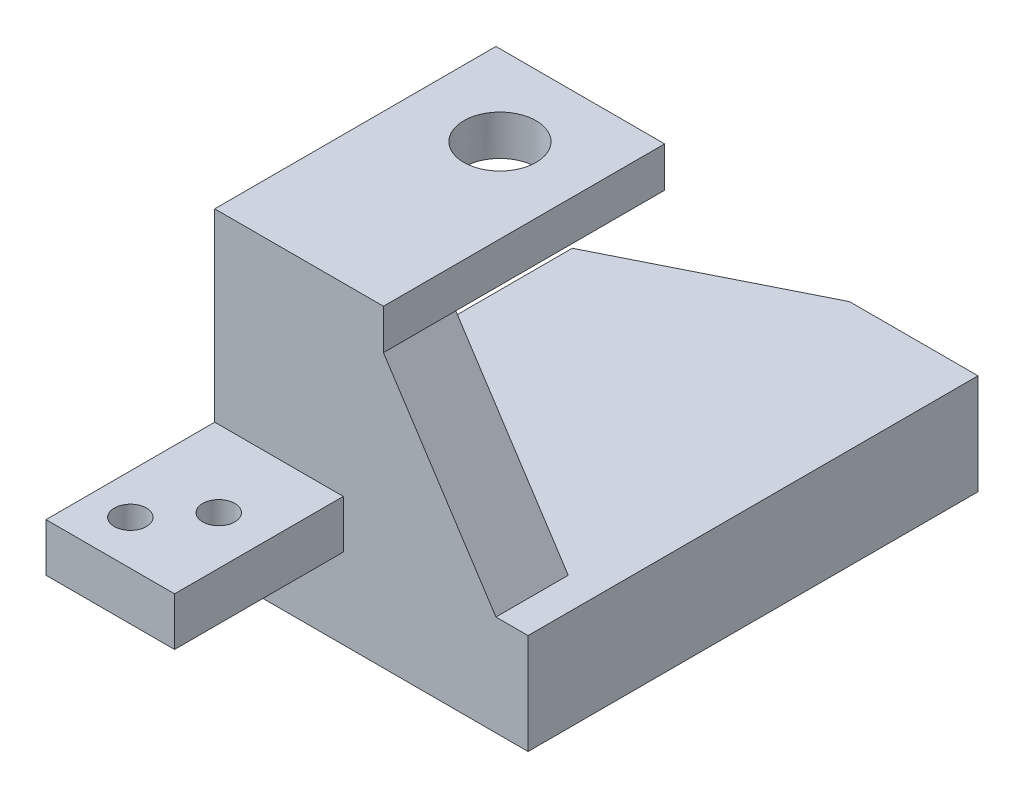
ISO-10303-21;
HEADER;
FILE_DESCRIPTION(('STEP AP214'),'2;1');
FILE_NAME('part.step','',(''),(''),'','','');
FILE_SCHEMA(('AUTOMOTIVE_DESIGN { 1 0 10303 214 1 1 1 1 }'));
ENDSEC;
DATA;
#1=APPLICATION_CONTEXT('core data for automotive mechanical design processes');
#2=APPLICATION_PROTOCOL_DEFINITION('international standard','automotive_design',2000,#1);
#3=PRODUCT_CONTEXT('',#1,'mechanical');
#4=PRODUCT('Part','Part','',(#3));
#5=PRODUCT_RELATED_PRODUCT_CATEGORY('part','',(#4));
#6=PRODUCT_DEFINITION_FORMATION('','',#4);
#7=PRODUCT_DEFINITION_CONTEXT('part definition',#1,'design');
#8=PRODUCT_DEFINITION('design','',#6,#7);
#9=PRODUCT_DEFINITION_SHAPE('','',#8);
#10=(LENGTH_UNIT() NAMED_UNIT(*) SI_UNIT(.MILLI.,.METRE.));
#11=(NAMED_UNIT(*) PLANE_ANGLE_UNIT() SI_UNIT($,.RADIAN.));
#12=(NAMED_UNIT(*) SI_UNIT($,.STERADIAN.) SOLID_ANGLE_UNIT());
#13=UNCERTAINTY_MEASURE_WITH_UNIT(LENGTH_MEASURE(1.E-05),#10,'distance_accuracy_value','');
#14=(GEOMETRIC_REPRESENTATION_CONTEXT(3) GLOBAL_UNCERTAINTY_ASSIGNED_CONTEXT((#13)) GLOBAL_UNIT_ASSIGNED_CONTEXT((#10,
#11,#12)) REPRESENTATION_CONTEXT('',''));
#15=CARTESIAN_POINT('',(0.,0.,0.));
#16=DIRECTION('',(0.,0.,1.));
#17=DIRECTION('',(1.,0.,0.));
#18=AXIS2_PLACEMENT_3D('',#15,#16,#17);
#19=CARTESIAN_POINT('',(57.3075506445673,-25.,0.));
#20=DIRECTION('',(-1.,0.,0.));
#21=DIRECTION('',(0.,0.,1.));
#22=AXIS2_PLACEMENT_3D('',#19,#20,#21);
#23=PLANE('',#22);
#24=DIRECTION('',(0.,1.,0.));
#25=VECTOR('',#24,1.);
#26=CARTESIAN_POINT('',(57.3075506445673,-25.,0.));
#27=LINE('',#26,#25);
#28=CARTESIAN_POINT('',(57.3075506445673,-25.,0.));
#29=VERTEX_POINT('',#28);
#30=CARTESIAN_POINT('',(57.3075506445673,-5.,0.));
#31=VERTEX_POINT('',#30);
#32=EDGE_CURVE('E266',#29,#31,#27,.T.);
#33=ORIENTED_EDGE('',*,*,#32,.T.);
#34=DIRECTION('',(0.,0.,1.));
#35=VECTOR('',#34,1.);
#36=CARTESIAN_POINT('',(57.3075506445673,-5.,0.));
#37=LINE('',#36,#35);
#38=CARTESIAN_POINT('',(57.3075506445673,-5.,42.));
#39=VERTEX_POINT('',#38);
#40=EDGE_CURVE('E53',#31,#39,#37,.T.);
#41=ORIENTED_EDGE('',*,*,#40,.T.);
#42=DIRECTION('',(0.,1.,0.));
#43=VECTOR('',#42,1.);
#44=CARTESIAN_POINT('',(57.3075506445673,-5.,42.));
#45=LINE('',#44,#43);
#46=CARTESIAN_POINT('',(57.3075506445673,7.,42.));
#47=VERTEX_POINT('',#46);
#48=EDGE_CURVE('E166',#39,#47,#45,.T.);
#49=ORIENTED_EDGE('',*,*,#48,.T.);
#50=DIRECTION('',(0.,0.,-1.));
#51=VECTOR('',#50,1.);
#52=CARTESIAN_POINT('',(57.3075506445673,7.,0.));
#53=LINE('',#52,#51);
#54=CARTESIAN_POINT('',(57.3075506445673,7.,0.));
#55=VERTEX_POINT('',#54);
#56=EDGE_CURVE('E163',#47,#55,#53,.T.);
#57=ORIENTED_EDGE('',*,*,#56,.T.);
#58=CARTESIAN_POINT('',(57.3075506445673,53.,0.));
#59=VERTEX_POINT('',#58);
#60=EDGE_CURVE('E246',#55,#59,#27,.T.);
#61=ORIENTED_EDGE('',*,*,#60,.T.);
#62=DIRECTION('',(0.,0.,1.));
#63=VECTOR('',#62,1.);
#64=CARTESIAN_POINT('',(57.3075506445673,53.,-18.));
#65=LINE('',#64,#63);
#66=CARTESIAN_POINT('',(57.3075506445673,53.,-70.));
#67=VERTEX_POINT('',#66);
#68=EDGE_CURVE('E215',#67,#59,#65,.T.);
#69=ORIENTED_EDGE('',*,*,#68,.F.);
#70=DIRECTION('',(0.,-1.,0.));
#71=VECTOR('',#70,1.);
#72=CARTESIAN_POINT('',(57.3075506445673,43.,-70.));
#73=LINE('',#72,#71);
#74=CARTESIAN_POINT('',(57.3075506445673,43.,-70.));
#75=VERTEX_POINT('',#74);
#76=EDGE_CURVE('E186',#67,#75,#73,.T.);
#77=ORIENTED_EDGE('',*,*,#76,.T.);
#78=DIRECTION('',(0.,0.,1.));
#79=VECTOR('',#78,1.);
#80=CARTESIAN_POINT('',(57.3075506445673,43.,-70.));
#81=LINE('',#80,#79);
#82=CARTESIAN_POINT('',(57.3075506445673,43.,-18.));
#83=VERTEX_POINT('',#82);
#84=EDGE_CURVE('E200',#75,#83,#81,.T.);
#85=ORIENTED_EDGE('',*,*,#84,.T.);
#86=DIRECTION('',(0.,1.,0.));
#87=VECTOR('',#86,1.);
#88=CARTESIAN_POINT('',(57.3075506445673,0.,-18.));
#89=LINE('',#88,#87);
#90=CARTESIAN_POINT('',(57.3075506445673,0.,-18.));
#91=VERTEX_POINT('',#90);
#92=EDGE_CURVE('E206',#91,#83,#89,.T.);
#93=ORIENTED_EDGE('',*,*,#92,.F.);
#94=DIRECTION('',(0.,0.,1.));
#95=VECTOR('',#94,1.);
#96=CARTESIAN_POINT('',(57.3075506445673,0.,0.));
#97=LINE('',#96,#95);
#98=CARTESIAN_POINT('',(57.3075506445672,0.,-89.));
#99=VERTEX_POINT('',#98);
#100=EDGE_CURVE('E223',#99,#91,#97,.T.);
#101=ORIENTED_EDGE('',*,*,#100,.F.);
#102=DIRECTION('',(0.,1.,0.));
#103=VECTOR('',#102,1.);
#104=CARTESIAN_POINT('',(57.3075506445672,-25.,-89.));
#105=LINE('',#104,#103);
#106=CARTESIAN_POINT('',(57.3075506445672,-25.,-89.));
#107=VERTEX_POINT('',#106);
#108=EDGE_CURVE('E46',#107,#99,#105,.T.);
#109=ORIENTED_EDGE('',*,*,#108,.F.);
#110=DIRECTION('',(0.,0.,1.));
#111=VECTOR('',#110,1.);
#112=CARTESIAN_POINT('',(57.3075506445673,-25.,0.));
#113=LINE('',#112,#111);
#114=EDGE_CURVE('E230',#107,#29,#113,.T.);
#115=ORIENTED_EDGE('',*,*,#114,.T.);
#116=EDGE_LOOP('',(#33,#41,#49,#57,#61,#69,#77,#85,#93,#101,#109,#115));
#117=FACE_BOUND('',#116,.T.);
#118=ADVANCED_FACE('F39',(#117),#23,.T.);
#119=CARTESIAN_POINT('',(57.3075506445672,-25.,-89.));
#120=DIRECTION('',(-0.447213595499958,0.,-0.894427190999916));
#121=DIRECTION('',(-0.894427190999916,0.,0.447213595499958));
#122=AXIS2_PLACEMENT_3D('',#119,#120,#121);
#123=PLANE('',#122);
#124=DIRECTION('',(-0.894427190999916,0.,0.447213595499958));
#125=VECTOR('',#124,1.);
#126=CARTESIAN_POINT('',(57.3075506445672,0.,-89.));
#127=LINE('',#126,#125);
#128=CARTESIAN_POINT('',(103.307550644567,0.,-112.));
#129=VERTEX_POINT('',#128);
#130=EDGE_CURVE('E234',#129,#99,#127,.T.);
#131=ORIENTED_EDGE('',*,*,#130,.F.);
#132=DIRECTION('',(0.,1.,0.));
#133=VECTOR('',#132,1.);
#134=CARTESIAN_POINT('',(103.307550644567,-25.,-112.));
#135=LINE('',#134,#133);
#136=CARTESIAN_POINT('',(103.307550644567,-25.,-112.));
#137=VERTEX_POINT('',#136);
#138=EDGE_CURVE('E260',#137,#129,#135,.T.);
#139=ORIENTED_EDGE('',*,*,#138,.F.);
#140=DIRECTION('',(-0.894427190999916,0.,0.447213595499958));
#141=VECTOR('',#140,1.);
#142=CARTESIAN_POINT('',(57.3075506445672,-25.,-89.));
#143=LINE('',#142,#141);
#144=EDGE_CURVE('E243',#137,#107,#143,.T.);
#145=ORIENTED_EDGE('',*,*,#144,.T.);
#146=ORIENTED_EDGE('',*,*,#108,.T.);
#147=EDGE_LOOP('',(#131,#139,#145,#146));
#148=FACE_BOUND('',#147,.T.);
#149=ADVANCED_FACE('F301',(#148),#123,.T.);
#150=CARTESIAN_POINT('',(135.307550644567,-25.,-112.));
#151=DIRECTION('',(0.,0.,-1.));
#152=DIRECTION('',(-1.,0.,0.));
#153=AXIS2_PLACEMENT_3D('',#150,#151,#152);
#154=PLANE('',#153);
#155=DIRECTION('',(-1.,0.,0.));
#156=VECTOR('',#155,1.);
#157=CARTESIAN_POINT('',(135.307550644567,0.,-112.));
#158=LINE('',#157,#156);
#159=CARTESIAN_POINT('',(135.307550644567,0.,-112.));
#160=VERTEX_POINT('',#159);
#161=EDGE_CURVE('E254',#160,#129,#158,.T.);
#162=ORIENTED_EDGE('',*,*,#161,.F.);
#163=DIRECTION('',(0.,1.,0.));
#164=VECTOR('',#163,1.);
#165=CARTESIAN_POINT('',(135.307550644567,-25.,-112.));
#166=LINE('',#165,#164);
#167=CARTESIAN_POINT('',(135.307550644567,-25.,-112.));
#168=VERTEX_POINT('',#167);
#169=EDGE_CURVE('E262',#168,#160,#166,.T.);
#170=ORIENTED_EDGE('',*,*,#169,.F.);
#171=DIRECTION('',(-1.,0.,0.));
#172=VECTOR('',#171,1.);
#173=CARTESIAN_POINT('',(135.307550644567,-25.,-112.));
#174=LINE('',#173,#172);
#175=EDGE_CURVE('E240',#168,#137,#174,.T.);
#176=ORIENTED_EDGE('',*,*,#175,.T.);
#177=ORIENTED_EDGE('',*,*,#138,.T.);
#178=EDGE_LOOP('',(#162,#170,#176,#177));
#179=FACE_BOUND('',#178,.T.);
#180=ADVANCED_FACE('F304',(#179),#154,.T.);
#181=CARTESIAN_POINT('',(135.307550644567,-25.,0.));
#182=DIRECTION('',(1.,0.,0.));
#183=DIRECTION('',(0.,0.,-1.));
#184=AXIS2_PLACEMENT_3D('',#181,#182,#183);
#185=PLANE('',#184);
#186=DIRECTION('',(0.,0.,-1.));
#187=VECTOR('',#186,1.);
#188=CARTESIAN_POINT('',(135.307550644567,0.,0.));
#189=LINE('',#188,#187);
#190=CARTESIAN_POINT('',(135.307550644567,0.,0.));
#191=VERTEX_POINT('',#190);
#192=EDGE_CURVE('E251',#191,#160,#189,.T.);
#193=ORIENTED_EDGE('',*,*,#192,.F.);
#194=DIRECTION('',(0.,1.,0.));
#195=VECTOR('',#194,1.);
#196=CARTESIAN_POINT('',(135.307550644567,-25.,0.));
#197=LINE('',#196,#195);
#198=CARTESIAN_POINT('',(135.307550644567,-25.,0.));
#199=VERTEX_POINT('',#198);
#200=EDGE_CURVE('E264',#199,#191,#197,.T.);
#201=ORIENTED_EDGE('',*,*,#200,.F.);
#202=DIRECTION('',(0.,0.,-1.));
#203=VECTOR('',#202,1.);
#204=CARTESIAN_POINT('',(135.307550644567,-25.,0.));
#205=LINE('',#204,#203);
#206=EDGE_CURVE('E237',#199,#168,#205,.T.);
#207=ORIENTED_EDGE('',*,*,#206,.T.);
#208=ORIENTED_EDGE('',*,*,#169,.T.);
#209=EDGE_LOOP('',(#193,#201,#207,#208));
#210=FACE_BOUND('',#209,.T.);
#211=ADVANCED_FACE('F307',(#210),#185,.T.);
#212=CARTESIAN_POINT('',(57.3075506445673,-25.,0.));
#213=DIRECTION('',(0.,0.,1.));
#214=DIRECTION('',(1.,0.,0.));
#215=AXIS2_PLACEMENT_3D('',#212,#213,#214);
#216=PLANE('',#215);
#217=DIRECTION('',(-1.,0.,0.));
#218=VECTOR('',#217,1.);
#219=CARTESIAN_POINT('',(89.3075506445673,7.,0.));
#220=LINE('',#219,#218);
#221=CARTESIAN_POINT('',(89.3075506445673,7.,0.));
#222=VERTEX_POINT('',#221);
#223=EDGE_CURVE('E162',#222,#55,#220,.T.);
#224=ORIENTED_EDGE('',*,*,#223,.F.);
#225=DIRECTION('',(0.,-1.,0.));
#226=VECTOR('',#225,1.);
#227=CARTESIAN_POINT('',(89.3075506445673,-5.,0.));
#228=LINE('',#227,#226);
#229=CARTESIAN_POINT('',(89.3075506445673,-5.,0.));
#230=VERTEX_POINT('',#229);
#231=EDGE_CURVE('E154',#222,#230,#228,.T.);
#232=ORIENTED_EDGE('',*,*,#231,.T.);
#233=DIRECTION('',(-1.,0.,0.));
#234=VECTOR('',#233,1.);
#235=CARTESIAN_POINT('',(89.3075506445673,-5.,0.));
#236=LINE('',#235,#234);
#237=EDGE_CURVE('E140',#230,#31,#236,.T.);
#238=ORIENTED_EDGE('',*,*,#237,.T.);
#239=ORIENTED_EDGE('',*,*,#32,.F.);
#240=DIRECTION('',(1.,0.,0.));
#241=VECTOR('',#240,1.);
#242=CARTESIAN_POINT('',(57.3075506445673,-25.,0.));
#243=LINE('',#242,#241);
#244=EDGE_CURVE('E233',#29,#199,#243,.T.);
#245=ORIENTED_EDGE('',*,*,#244,.T.);
#246=ORIENTED_EDGE('',*,*,#200,.T.);
#247=DIRECTION('',(1.,0.,0.));
#248=VECTOR('',#247,1.);
#249=CARTESIAN_POINT('',(57.3075506445673,0.,0.));
#250=LINE('',#249,#248);
#251=CARTESIAN_POINT('',(127.307550644567,0.,0.));
#252=VERTEX_POINT('',#251);
#253=EDGE_CURVE('E249',#252,#191,#250,.T.);
#254=ORIENTED_EDGE('',*,*,#253,.F.);
#255=DIRECTION('',(-0.545673171437432,0.837998084707486,0.));
#256=VECTOR('',#255,1.);
#257=CARTESIAN_POINT('',(89.4005549342214,58.2143148408883,0.));
#258=LINE('',#257,#256);
#259=CARTESIAN_POINT('',(99.3075506445672,43.,0.));
#260=VERTEX_POINT('',#259);
#261=EDGE_CURVE('E61',#252,#260,#258,.T.);
#262=ORIENTED_EDGE('',*,*,#261,.T.);
#263=DIRECTION('',(0.,1.,0.));
#264=VECTOR('',#263,1.);
#265=CARTESIAN_POINT('',(99.3075506445673,0.,0.));
#266=LINE('',#265,#264);
#267=CARTESIAN_POINT('',(99.3075506445673,53.,0.));
#268=VERTEX_POINT('',#267);
#269=EDGE_CURVE('E210',#260,#268,#266,.T.);
#270=ORIENTED_EDGE('',*,*,#269,.T.);
#271=DIRECTION('',(1.,0.,0.));
#272=VECTOR('',#271,1.);
#273=CARTESIAN_POINT('',(0.,53.,0.));
#274=LINE('',#273,#272);
#275=EDGE_CURVE('E203',#59,#268,#274,.T.);
#276=ORIENTED_EDGE('',*,*,#275,.F.);
#277=ORIENTED_EDGE('',*,*,#60,.F.);
#278=EDGE_LOOP('',(#224,#232,#238,#239,#245,#246,#254,#262,#270,#276,#277));
#279=FACE_BOUND('',#278,.T.);
#280=ADVANCED_FACE('F160',(#279),#216,.T.);
#281=CARTESIAN_POINT('',(0.,-25.,0.));
#282=DIRECTION('',(0.,1.,0.));
#283=DIRECTION('',(0.,0.,1.));
#284=AXIS2_PLACEMENT_3D('',#281,#282,#283);
#285=PLANE('',#284);
#286=ORIENTED_EDGE('',*,*,#114,.F.);
#287=ORIENTED_EDGE('',*,*,#144,.F.);
#288=ORIENTED_EDGE('',*,*,#175,.F.);
#289=ORIENTED_EDGE('',*,*,#206,.F.);
#290=ORIENTED_EDGE('',*,*,#244,.F.);
#291=EDGE_LOOP('',(#286,#287,#288,#289,#290));
#292=FACE_BOUND('',#291,.T.);
#293=ADVANCED_FACE('F298',(#292),#285,.F.);
#294=CARTESIAN_POINT('',(0.,0.,0.));
#295=DIRECTION('',(0.,1.,0.));
#296=DIRECTION('',(0.,0.,1.));
#297=AXIS2_PLACEMENT_3D('',#294,#295,#296);
#298=PLANE('',#297);
#299=DIRECTION('',(-1.,0.,0.));
#300=VECTOR('',#299,1.);
#301=CARTESIAN_POINT('',(0.,0.,-18.));
#302=LINE('',#301,#300);
#303=CARTESIAN_POINT('',(127.307550644567,0.,-18.));
#304=VERTEX_POINT('',#303);
#305=EDGE_CURVE('E209',#304,#91,#302,.T.);
#306=ORIENTED_EDGE('',*,*,#305,.F.);
#307=DIRECTION('',(0.,0.,1.));
#308=VECTOR('',#307,1.);
#309=CARTESIAN_POINT('',(127.307550644567,0.,-18.));
#310=LINE('',#309,#308);
#311=EDGE_CURVE('E226',#304,#252,#310,.T.);
#312=ORIENTED_EDGE('',*,*,#311,.T.);
#313=ORIENTED_EDGE('',*,*,#253,.T.);
#314=ORIENTED_EDGE('',*,*,#192,.T.);
#315=ORIENTED_EDGE('',*,*,#161,.T.);
#316=ORIENTED_EDGE('',*,*,#130,.T.);
#317=ORIENTED_EDGE('',*,*,#100,.T.);
#318=EDGE_LOOP('',(#306,#312,#313,#314,#315,#316,#317));
#319=FACE_BOUND('',#318,.T.);
#320=ADVANCED_FACE('F291',(#319),#298,.T.);
#321=CARTESIAN_POINT('',(0.,53.,-18.));
#322=DIRECTION('',(0.,-1.,0.));
#323=DIRECTION('',(0.,0.,-1.));
#324=AXIS2_PLACEMENT_3D('',#321,#322,#323);
#325=PLANE('',#324);
#326=CARTESIAN_POINT('',(78.3075506445673,53.,-50.));
#327=DIRECTION('',(0.,1.,0.));
#328=DIRECTION('',(0.,0.,1.));
#329=AXIS2_PLACEMENT_3D('',#326,#327,#328);
#330=CIRCLE('',#329,9.);
#331=CARTESIAN_POINT('',(78.3075506445673,53.,-41.));
#332=VERTEX_POINT('',#331);
#333=EDGE_CURVE('E183',#332,#332,#330,.T.);
#334=ORIENTED_EDGE('',*,*,#333,.F.);
#335=EDGE_LOOP('',(#334));
#336=FACE_BOUND('',#335,.T.);
#337=ORIENTED_EDGE('',*,*,#275,.T.);
#338=DIRECTION('',(0.,0.,1.));
#339=VECTOR('',#338,1.);
#340=CARTESIAN_POINT('',(99.3075506445673,53.,-18.));
#341=LINE('',#340,#339);
#342=CARTESIAN_POINT('',(99.3075506445673,53.,-70.));
#343=VERTEX_POINT('',#342);
#344=EDGE_CURVE('E221',#343,#268,#341,.T.);
#345=ORIENTED_EDGE('',*,*,#344,.F.);
#346=DIRECTION('',(-1.,0.,0.));
#347=VECTOR('',#346,1.);
#348=CARTESIAN_POINT('',(57.3075506445673,53.,-70.));
#349=LINE('',#348,#347);
#350=EDGE_CURVE('E197',#343,#67,#349,.T.);
#351=ORIENTED_EDGE('',*,*,#350,.T.);
#352=ORIENTED_EDGE('',*,*,#68,.T.);
#353=EDGE_LOOP('',(#337,#345,#351,#352));
#354=FACE_BOUND('',#353,.T.);
#355=ADVANCED_FACE('F272',(#336,#354),#325,.F.);
#356=CARTESIAN_POINT('',(99.3075506445673,0.,-18.));
#357=DIRECTION('',(1.,0.,0.));
#358=DIRECTION('',(0.,0.,-1.));
#359=AXIS2_PLACEMENT_3D('',#356,#357,#358);
#360=PLANE('',#359);
#361=ORIENTED_EDGE('',*,*,#269,.F.);
#362=DIRECTION('',(0.,0.,1.));
#363=VECTOR('',#362,1.);
#364=CARTESIAN_POINT('',(99.3075506445672,43.,-18.));
#365=LINE('',#364,#363);
#366=CARTESIAN_POINT('',(99.3075506445672,43.,-18.));
#367=VERTEX_POINT('',#366);
#368=EDGE_CURVE('E224',#367,#260,#365,.T.);
#369=ORIENTED_EDGE('',*,*,#368,.F.);
#370=DIRECTION('',(0.,0.,1.));
#371=VECTOR('',#370,1.);
#372=CARTESIAN_POINT('',(99.3075506445672,43.,-70.));
#373=LINE('',#372,#371);
#374=CARTESIAN_POINT('',(99.3075506445672,43.,-70.));
#375=VERTEX_POINT('',#374);
#376=EDGE_CURVE('E201',#375,#367,#373,.T.);
#377=ORIENTED_EDGE('',*,*,#376,.F.);
#378=DIRECTION('',(0.,1.,0.));
#379=VECTOR('',#378,1.);
#380=CARTESIAN_POINT('',(99.3075506445673,53.,-70.));
#381=LINE('',#380,#379);
#382=EDGE_CURVE('E194',#375,#343,#381,.T.);
#383=ORIENTED_EDGE('',*,*,#382,.T.);
#384=ORIENTED_EDGE('',*,*,#344,.T.);
#385=EDGE_LOOP('',(#361,#369,#377,#383,#384));
#386=FACE_BOUND('',#385,.T.);
#387=ADVANCED_FACE('F278',(#386),#360,.T.);
#388=CARTESIAN_POINT('',(89.4005549342214,58.2143148408883,-18.));
#389=DIRECTION('',(0.837998084707486,0.545673171437432,0.));
#390=DIRECTION('',(-0.545673171437432,0.837998084707486,0.));
#391=AXIS2_PLACEMENT_3D('',#388,#389,#390);
#392=PLANE('',#391);
#393=ORIENTED_EDGE('',*,*,#261,.F.);
#394=ORIENTED_EDGE('',*,*,#311,.F.);
#395=DIRECTION('',(-0.545673171437432,0.837998084707486,0.));
#396=VECTOR('',#395,1.);
#397=CARTESIAN_POINT('',(89.4005549342214,58.2143148408883,-18.));
#398=LINE('',#397,#396);
#399=EDGE_CURVE('E212',#304,#367,#398,.T.);
#400=ORIENTED_EDGE('',*,*,#399,.T.);
#401=ORIENTED_EDGE('',*,*,#368,.T.);
#402=EDGE_LOOP('',(#393,#394,#400,#401));
#403=FACE_BOUND('',#402,.T.);
#404=ADVANCED_FACE('F330',(#403),#392,.T.);
#405=CARTESIAN_POINT('',(0.,0.,-18.));
#406=DIRECTION('',(0.,0.,1.));
#407=DIRECTION('',(1.,0.,0.));
#408=AXIS2_PLACEMENT_3D('',#405,#406,#407);
#409=PLANE('',#408);
#410=ORIENTED_EDGE('',*,*,#92,.T.);
#411=DIRECTION('',(1.,0.,0.));
#412=VECTOR('',#411,1.);
#413=CARTESIAN_POINT('',(0.,43.,-18.));
#414=LINE('',#413,#412);
#415=EDGE_CURVE('E11',#83,#367,#414,.T.);
#416=ORIENTED_EDGE('',*,*,#415,.T.);
#417=ORIENTED_EDGE('',*,*,#399,.F.);
#418=ORIENTED_EDGE('',*,*,#305,.T.);
#419=EDGE_LOOP('',(#410,#416,#417,#418));
#420=FACE_BOUND('',#419,.T.);
#421=ADVANCED_FACE('F287',(#420),#409,.F.);
#422=CARTESIAN_POINT('',(99.3075506445672,43.,-70.));
#423=DIRECTION('',(0.,-1.,0.));
#424=DIRECTION('',(0.,0.,-1.));
#425=AXIS2_PLACEMENT_3D('',#422,#423,#424);
#426=PLANE('',#425);
#427=CARTESIAN_POINT('',(78.3075506445673,43.,-50.));
#428=DIRECTION('',(0.,-1.,0.));
#429=DIRECTION('',(0.,0.,-1.));
#430=AXIS2_PLACEMENT_3D('',#427,#428,#429);
#431=CIRCLE('',#430,9.);
#432=CARTESIAN_POINT('',(78.3075506445673,43.,-59.));
#433=VERTEX_POINT('',#432);
#434=EDGE_CURVE('E179',#433,#433,#431,.F.);
#435=ORIENTED_EDGE('',*,*,#434,.T.);
#436=EDGE_LOOP('',(#435));
#437=FACE_BOUND('',#436,.T.);
#438=ORIENTED_EDGE('',*,*,#415,.F.);
#439=ORIENTED_EDGE('',*,*,#84,.F.);
#440=DIRECTION('',(1.,0.,0.));
#441=VECTOR('',#440,1.);
#442=CARTESIAN_POINT('',(99.3075506445672,43.,-70.));
#443=LINE('',#442,#441);
#444=EDGE_CURVE('E191',#75,#375,#443,.T.);
#445=ORIENTED_EDGE('',*,*,#444,.T.);
#446=ORIENTED_EDGE('',*,*,#376,.T.);
#447=EDGE_LOOP('',(#438,#439,#445,#446));
#448=FACE_BOUND('',#447,.T.);
#449=ADVANCED_FACE('F337',(#437,#448),#426,.T.);
#450=CARTESIAN_POINT('',(0.,0.,-70.));
#451=DIRECTION('',(0.,0.,-1.));
#452=DIRECTION('',(-1.,0.,0.));
#453=AXIS2_PLACEMENT_3D('',#450,#451,#452);
#454=PLANE('',#453);
#455=ORIENTED_EDGE('',*,*,#76,.F.);
#456=ORIENTED_EDGE('',*,*,#350,.F.);
#457=ORIENTED_EDGE('',*,*,#382,.F.);
#458=ORIENTED_EDGE('',*,*,#444,.F.);
#459=EDGE_LOOP('',(#455,#456,#457,#458));
#460=FACE_BOUND('',#459,.T.);
#461=ADVANCED_FACE('F282',(#460),#454,.T.);
#462=CARTESIAN_POINT('',(78.3075506445673,-25.001,-50.));
#463=DIRECTION('',(0.,1.,0.));
#464=DIRECTION('',(0.,0.,1.));
#465=AXIS2_PLACEMENT_3D('',#462,#463,#464);
#466=CYLINDRICAL_SURFACE('',#465,9.);
#467=ORIENTED_EDGE('',*,*,#434,.F.);
#468=EDGE_LOOP('',(#467));
#469=FACE_BOUND('',#468,.T.);
#470=ORIENTED_EDGE('',*,*,#333,.T.);
#471=EDGE_LOOP('',(#470));
#472=FACE_BOUND('',#471,.T.);
#473=ADVANCED_FACE('F343',(#469,#472),#466,.F.);
#474=CARTESIAN_POINT('',(89.3075506445673,7.,0.));
#475=DIRECTION('',(0.,1.,0.));
#476=DIRECTION('',(0.,0.,1.));
#477=AXIS2_PLACEMENT_3D('',#474,#475,#476);
#478=PLANE('',#477);
#479=CARTESIAN_POINT('',(67.3075506445673,7.,31.));
#480=DIRECTION('',(0.,1.,0.));
#481=DIRECTION('',(0.,0.,1.));
#482=AXIS2_PLACEMENT_3D('',#479,#480,#481);
#483=CIRCLE('',#482,4.00000000000001);
#484=CARTESIAN_POINT('',(67.3075506445673,7.,35.));
#485=VERTEX_POINT('',#484);
#486=EDGE_CURVE('E175',#485,#485,#483,.T.);
#487=ORIENTED_EDGE('',*,*,#486,.F.);
#488=EDGE_LOOP('',(#487));
#489=FACE_BOUND('',#488,.T.);
#490=CARTESIAN_POINT('',(77.3075506445673,7.,19.));
#491=DIRECTION('',(0.,1.,0.));
#492=DIRECTION('',(0.,0.,1.));
#493=AXIS2_PLACEMENT_3D('',#490,#491,#492);
#494=CIRCLE('',#493,4.00000000000001);
#495=CARTESIAN_POINT('',(77.3075506445673,7.,23.));
#496=VERTEX_POINT('',#495);
#497=EDGE_CURVE('E169',#496,#496,#494,.T.);
#498=ORIENTED_EDGE('',*,*,#497,.F.);
#499=EDGE_LOOP('',(#498));
#500=FACE_BOUND('',#499,.T.);
#501=ORIENTED_EDGE('',*,*,#56,.F.);
#502=DIRECTION('',(-1.,0.,0.));
#503=VECTOR('',#502,1.);
#504=CARTESIAN_POINT('',(89.3075506445673,7.,42.));
#505=LINE('',#504,#503);
#506=CARTESIAN_POINT('',(89.3075506445673,7.,42.));
#507=VERTEX_POINT('',#506);
#508=EDGE_CURVE('E180',#507,#47,#505,.T.);
#509=ORIENTED_EDGE('',*,*,#508,.F.);
#510=DIRECTION('',(0.,0.,-1.));
#511=VECTOR('',#510,1.);
#512=CARTESIAN_POINT('',(89.3075506445673,7.,0.));
#513=LINE('',#512,#511);
#514=EDGE_CURVE('E148',#507,#222,#513,.T.);
#515=ORIENTED_EDGE('',*,*,#514,.T.);
#516=ORIENTED_EDGE('',*,*,#223,.T.);
#517=EDGE_LOOP('',(#501,#509,#515,#516));
#518=FACE_BOUND('',#517,.T.);
#519=ADVANCED_FACE('F346',(#489,#500,#518),#478,.T.);
#520=CARTESIAN_POINT('',(89.3075506445673,-5.,42.));
#521=DIRECTION('',(0.,0.,1.));
#522=DIRECTION('',(1.,0.,0.));
#523=AXIS2_PLACEMENT_3D('',#520,#521,#522);
#524=PLANE('',#523);
#525=ORIENTED_EDGE('',*,*,#48,.F.);
#526=DIRECTION('',(-1.,0.,0.));
#527=VECTOR('',#526,1.);
#528=CARTESIAN_POINT('',(89.3075506445673,-5.,42.));
#529=LINE('',#528,#527);
#530=CARTESIAN_POINT('',(89.3075506445673,-5.,42.));
#531=VERTEX_POINT('',#530);
#532=EDGE_CURVE('E147',#531,#39,#529,.T.);
#533=ORIENTED_EDGE('',*,*,#532,.F.);
#534=DIRECTION('',(0.,1.,0.));
#535=VECTOR('',#534,1.);
#536=CARTESIAN_POINT('',(89.3075506445673,-5.,42.));
#537=LINE('',#536,#535);
#538=EDGE_CURVE('E157',#531,#507,#537,.T.);
#539=ORIENTED_EDGE('',*,*,#538,.T.);
#540=ORIENTED_EDGE('',*,*,#508,.T.);
#541=EDGE_LOOP('',(#525,#533,#539,#540));
#542=FACE_BOUND('',#541,.T.);
#543=ADVANCED_FACE('F350',(#542),#524,.T.);
#544=CARTESIAN_POINT('',(89.3075506445673,-5.,0.));
#545=DIRECTION('',(0.,-1.,0.));
#546=DIRECTION('',(0.,0.,-1.));
#547=AXIS2_PLACEMENT_3D('',#544,#545,#546);
#548=PLANE('',#547);
#549=CARTESIAN_POINT('',(67.3075506445673,-5.,31.));
#550=DIRECTION('',(0.,-1.,0.));
#551=DIRECTION('',(0.,0.,-1.));
#552=AXIS2_PLACEMENT_3D('',#549,#550,#551);
#553=CIRCLE('',#552,4.00000000000001);
#554=CARTESIAN_POINT('',(67.3075506445673,-5.,27.));
#555=VERTEX_POINT('',#554);
#556=EDGE_CURVE('E372',#555,#555,#553,.F.);
#557=ORIENTED_EDGE('',*,*,#556,.T.);
#558=EDGE_LOOP('',(#557));
#559=FACE_BOUND('',#558,.T.);
#560=CARTESIAN_POINT('',(77.3075506445673,-5.,19.));
#561=DIRECTION('',(0.,-1.,0.));
#562=DIRECTION('',(0.,0.,-1.));
#563=AXIS2_PLACEMENT_3D('',#560,#561,#562);
#564=CIRCLE('',#563,4.00000000000001);
#565=CARTESIAN_POINT('',(77.3075506445673,-5.,15.));
#566=VERTEX_POINT('',#565);
#567=EDGE_CURVE('E376',#566,#566,#564,.F.);
#568=ORIENTED_EDGE('',*,*,#567,.T.);
#569=EDGE_LOOP('',(#568));
#570=FACE_BOUND('',#569,.T.);
#571=ORIENTED_EDGE('',*,*,#40,.F.);
#572=ORIENTED_EDGE('',*,*,#237,.F.);
#573=DIRECTION('',(0.,0.,1.));
#574=VECTOR('',#573,1.);
#575=CARTESIAN_POINT('',(89.3075506445673,-5.,0.));
#576=LINE('',#575,#574);
#577=EDGE_CURVE('E143',#230,#531,#576,.T.);
#578=ORIENTED_EDGE('',*,*,#577,.T.);
#579=ORIENTED_EDGE('',*,*,#532,.T.);
#580=EDGE_LOOP('',(#571,#572,#578,#579));
#581=FACE_BOUND('',#580,.T.);
#582=ADVANCED_FACE('F142',(#559,#570,#581),#548,.T.);
#583=CARTESIAN_POINT('',(89.3075506445673,0.,0.));
#584=DIRECTION('',(1.,0.,0.));
#585=DIRECTION('',(0.,0.,-1.));
#586=AXIS2_PLACEMENT_3D('',#583,#584,#585);
#587=PLANE('',#586);
#588=ORIENTED_EDGE('',*,*,#231,.F.);
#589=ORIENTED_EDGE('',*,*,#514,.F.);
#590=ORIENTED_EDGE('',*,*,#538,.F.);
#591=ORIENTED_EDGE('',*,*,#577,.F.);
#592=EDGE_LOOP('',(#588,#589,#590,#591));
#593=FACE_BOUND('',#592,.T.);
#594=ADVANCED_FACE('F152',(#593),#587,.T.);
#595=CARTESIAN_POINT('',(77.3075506445673,-25.001,19.));
#596=DIRECTION('',(0.,1.,0.));
#597=DIRECTION('',(0.,0.,1.));
#598=AXIS2_PLACEMENT_3D('',#595,#596,#597);
#599=CYLINDRICAL_SURFACE('',#598,4.00000000000001);
#600=ORIENTED_EDGE('',*,*,#567,.F.);
#601=EDGE_LOOP('',(#600));
#602=FACE_BOUND('',#601,.T.);
#603=ORIENTED_EDGE('',*,*,#497,.T.);
#604=EDGE_LOOP('',(#603));
#605=FACE_BOUND('',#604,.T.);
#606=ADVANCED_FACE('F360',(#602,#605),#599,.F.);
#607=CARTESIAN_POINT('',(67.3075506445673,-25.001,31.));
#608=DIRECTION('',(0.,1.,0.));
#609=DIRECTION('',(0.,0.,1.));
#610=AXIS2_PLACEMENT_3D('',#607,#608,#609);
#611=CYLINDRICAL_SURFACE('',#610,4.00000000000001);
#612=ORIENTED_EDGE('',*,*,#556,.F.);
#613=EDGE_LOOP('',(#612));
#614=FACE_BOUND('',#613,.T.);
#615=ORIENTED_EDGE('',*,*,#486,.T.);
#616=EDGE_LOOP('',(#615));
#617=FACE_BOUND('',#616,.T.);
#618=ADVANCED_FACE('F363',(#614,#617),#611,.F.);
#619=CLOSED_SHELL('',(#118,#149,#180,#211,#280,#293,#320,#355,#387,#404,#421,#449,#461,#473,
#519,#543,#582,#594,#606,#618));
#620=MANIFOLD_SOLID_BREP('B2',#619);
#621=ADVANCED_BREP_SHAPE_REPRESENTATION('',(#18,#620),#14);
#622=SHAPE_DEFINITION_REPRESENTATION(#9,#621);
ENDSEC;
END-ISO-10303-21;
